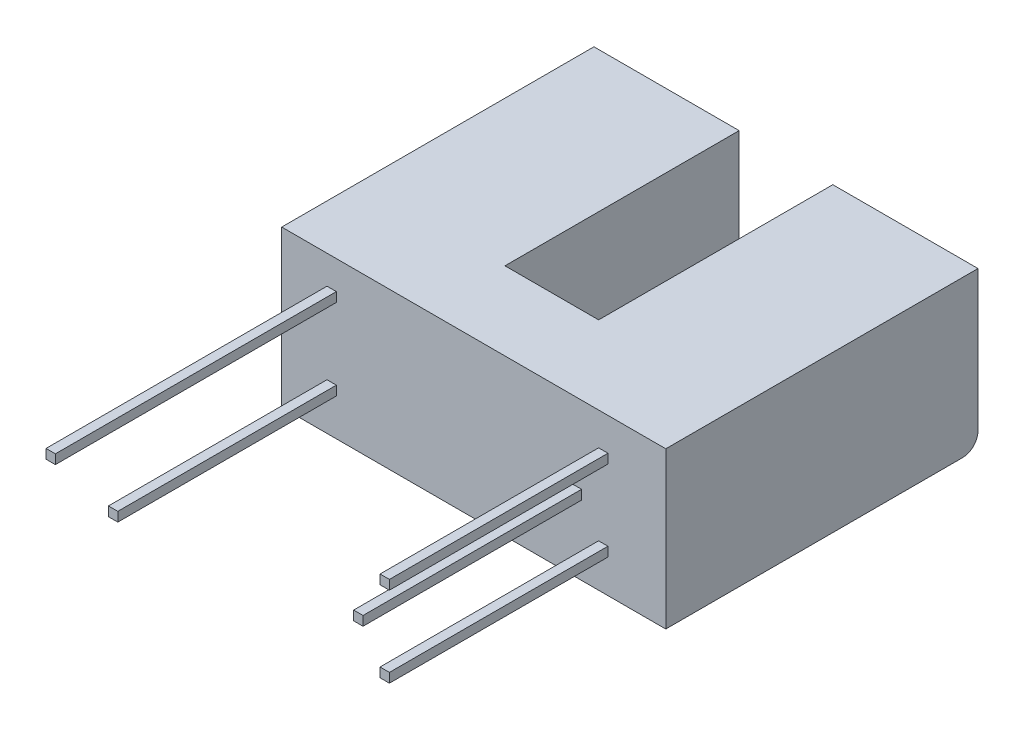
ISO-10303-21;
HEADER;
FILE_DESCRIPTION(('STEP AP214'),'2;1');
FILE_NAME('part.step','',(''),(''),'','','');
FILE_SCHEMA(('AUTOMOTIVE_DESIGN { 1 0 10303 214 1 1 1 1 }'));
ENDSEC;
DATA;
#1=APPLICATION_CONTEXT('core data for automotive mechanical design processes');
#2=APPLICATION_PROTOCOL_DEFINITION('international standard','automotive_design',2000,#1);
#3=PRODUCT_CONTEXT('',#1,'mechanical');
#4=PRODUCT('Part','Part','',(#3));
#5=PRODUCT_RELATED_PRODUCT_CATEGORY('part','',(#4));
#6=PRODUCT_DEFINITION_FORMATION('','',#4);
#7=PRODUCT_DEFINITION_CONTEXT('part definition',#1,'design');
#8=PRODUCT_DEFINITION('design','',#6,#7);
#9=PRODUCT_DEFINITION_SHAPE('','',#8);
#10=(LENGTH_UNIT() NAMED_UNIT(*) SI_UNIT(.MILLI.,.METRE.));
#11=(NAMED_UNIT(*) PLANE_ANGLE_UNIT() SI_UNIT($,.RADIAN.));
#12=(NAMED_UNIT(*) SI_UNIT($,.STERADIAN.) SOLID_ANGLE_UNIT());
#13=UNCERTAINTY_MEASURE_WITH_UNIT(LENGTH_MEASURE(1.E-05),#10,'distance_accuracy_value','');
#14=(GEOMETRIC_REPRESENTATION_CONTEXT(3) GLOBAL_UNCERTAINTY_ASSIGNED_CONTEXT((#13)) GLOBAL_UNIT_ASSIGNED_CONTEXT((#10,
#11,#12)) REPRESENTATION_CONTEXT('',''));
#15=CARTESIAN_POINT('',(0.,0.,0.));
#16=DIRECTION('',(0.,0.,1.));
#17=DIRECTION('',(1.,0.,0.));
#18=AXIS2_PLACEMENT_3D('',#15,#16,#17);
#19=CARTESIAN_POINT('',(-6.15,5.,5.));
#20=DIRECTION('',(0.,0.,-1.));
#21=DIRECTION('',(-1.,0.,0.));
#22=AXIS2_PLACEMENT_3D('',#19,#20,#21);
#23=PLANE('',#22);
#24=DIRECTION('',(0.,-1.,0.));
#25=VECTOR('',#24,1.);
#26=CARTESIAN_POINT('',(3.99904048228154,1.37213930348259,5.));
#27=LINE('',#26,#25);
#28=CARTESIAN_POINT('',(3.99904048228154,1.37213930348259,5.));
#29=VERTEX_POINT('',#28);
#30=CARTESIAN_POINT('',(3.99904048228154,1.07213930348259,5.));
#31=VERTEX_POINT('',#30);
#32=EDGE_CURVE('E250',#29,#31,#27,.T.);
#33=ORIENTED_EDGE('',*,*,#32,.F.);
#34=DIRECTION('',(-1.,0.,0.));
#35=VECTOR('',#34,1.);
#36=CARTESIAN_POINT('',(3.99904048228154,1.37213930348259,5.));
#37=LINE('',#36,#35);
#38=CARTESIAN_POINT('',(4.29904048228154,1.37213930348259,5.));
#39=VERTEX_POINT('',#38);
#40=EDGE_CURVE('E263',#39,#29,#37,.T.);
#41=ORIENTED_EDGE('',*,*,#40,.F.);
#42=DIRECTION('',(0.,1.,0.));
#43=VECTOR('',#42,1.);
#44=CARTESIAN_POINT('',(4.29904048228154,1.37213930348259,5.));
#45=LINE('',#44,#43);
#46=CARTESIAN_POINT('',(4.29904048228154,1.07213930348259,5.));
#47=VERTEX_POINT('',#46);
#48=EDGE_CURVE('E272',#47,#39,#45,.T.);
#49=ORIENTED_EDGE('',*,*,#48,.F.);
#50=DIRECTION('',(1.,0.,0.));
#51=VECTOR('',#50,1.);
#52=CARTESIAN_POINT('',(3.99904048228154,1.07213930348259,5.));
#53=LINE('',#52,#51);
#54=EDGE_CURVE('E253',#31,#47,#53,.T.);
#55=ORIENTED_EDGE('',*,*,#54,.F.);
#56=EDGE_LOOP('',(#33,#41,#49,#55));
#57=FACE_BOUND('',#56,.T.);
#58=DIRECTION('',(0.,-1.,0.));
#59=VECTOR('',#58,1.);
#60=CARTESIAN_POINT('',(-4.69970149253732,1.49029850746269,5.));
#61=LINE('',#60,#59);
#62=CARTESIAN_POINT('',(-4.69970149253732,1.49029850746269,5.));
#63=VERTEX_POINT('',#62);
#64=CARTESIAN_POINT('',(-4.69970149253732,1.19029850746269,5.));
#65=VERTEX_POINT('',#64);
#66=EDGE_CURVE('E320',#63,#65,#61,.T.);
#67=ORIENTED_EDGE('',*,*,#66,.F.);
#68=DIRECTION('',(1.,0.,0.));
#69=VECTOR('',#68,1.);
#70=CARTESIAN_POINT('',(-4.69970149253732,1.49029850746269,5.));
#71=LINE('',#70,#69);
#72=CARTESIAN_POINT('',(-4.39970149253732,1.49029850746269,5.));
#73=VERTEX_POINT('',#72);
#74=EDGE_CURVE('E325',#63,#73,#71,.T.);
#75=ORIENTED_EDGE('',*,*,#74,.T.);
#76=DIRECTION('',(0.,-1.,0.));
#77=VECTOR('',#76,1.);
#78=CARTESIAN_POINT('',(-4.39970149253732,1.49029850746269,5.));
#79=LINE('',#78,#77);
#80=CARTESIAN_POINT('',(-4.39970149253732,1.19029850746269,5.));
#81=VERTEX_POINT('',#80);
#82=EDGE_CURVE('E339',#73,#81,#79,.T.);
#83=ORIENTED_EDGE('',*,*,#82,.T.);
#84=DIRECTION('',(1.,0.,0.));
#85=VECTOR('',#84,1.);
#86=CARTESIAN_POINT('',(-4.69970149253732,1.19029850746269,5.));
#87=LINE('',#86,#85);
#88=EDGE_CURVE('E336',#65,#81,#87,.T.);
#89=ORIENTED_EDGE('',*,*,#88,.F.);
#90=EDGE_LOOP('',(#67,#75,#83,#89));
#91=FACE_BOUND('',#90,.T.);
#92=DIRECTION('',(1.,0.,0.));
#93=VECTOR('',#92,1.);
#94=CARTESIAN_POINT('',(-6.15,0.,5.));
#95=LINE('',#94,#93);
#96=CARTESIAN_POINT('',(-6.15,0.,5.));
#97=VERTEX_POINT('',#96);
#98=CARTESIAN_POINT('',(6.15,0.,5.));
#99=VERTEX_POINT('',#98);
#100=EDGE_CURVE('E414',#97,#99,#95,.T.);
#101=ORIENTED_EDGE('',*,*,#100,.T.);
#102=DIRECTION('',(0.,-1.,0.));
#103=VECTOR('',#102,1.);
#104=CARTESIAN_POINT('',(6.15,5.,5.));
#105=LINE('',#104,#103);
#106=CARTESIAN_POINT('',(6.15,5.,5.));
#107=VERTEX_POINT('',#106);
#108=EDGE_CURVE('E422',#107,#99,#105,.T.);
#109=ORIENTED_EDGE('',*,*,#108,.F.);
#110=DIRECTION('',(1.,0.,0.));
#111=VECTOR('',#110,1.);
#112=CARTESIAN_POINT('',(-6.15,5.,5.));
#113=LINE('',#112,#111);
#114=CARTESIAN_POINT('',(-6.15,5.,5.));
#115=VERTEX_POINT('',#114);
#116=EDGE_CURVE('E420',#115,#107,#113,.T.);
#117=ORIENTED_EDGE('',*,*,#116,.F.);
#118=DIRECTION('',(0.,-1.,0.));
#119=VECTOR('',#118,1.);
#120=CARTESIAN_POINT('',(-6.15,5.,5.));
#121=LINE('',#120,#119);
#122=EDGE_CURVE('E430',#115,#97,#121,.T.);
#123=ORIENTED_EDGE('',*,*,#122,.T.);
#124=EDGE_LOOP('',(#101,#109,#117,#123));
#125=FACE_BOUND('',#124,.T.);
#126=DIRECTION('',(0.,-1.,0.));
#127=VECTOR('',#126,1.);
#128=CARTESIAN_POINT('',(-4.69970149253732,4.08507462686571,5.));
#129=LINE('',#128,#127);
#130=CARTESIAN_POINT('',(-4.69970149253732,4.08507462686571,5.));
#131=VERTEX_POINT('',#130);
#132=CARTESIAN_POINT('',(-4.69970149253732,3.78507462686571,5.));
#133=VERTEX_POINT('',#132);
#134=EDGE_CURVE('E352',#131,#133,#129,.T.);
#135=ORIENTED_EDGE('',*,*,#134,.F.);
#136=DIRECTION('',(-1.,0.,0.));
#137=VECTOR('',#136,1.);
#138=CARTESIAN_POINT('',(-4.69970149253732,4.08507462686571,5.));
#139=LINE('',#138,#137);
#140=CARTESIAN_POINT('',(-4.39970149253732,4.08507462686571,5.));
#141=VERTEX_POINT('',#140);
#142=EDGE_CURVE('E357',#141,#131,#139,.T.);
#143=ORIENTED_EDGE('',*,*,#142,.F.);
#144=DIRECTION('',(0.,1.,0.));
#145=VECTOR('',#144,1.);
#146=CARTESIAN_POINT('',(-4.39970149253732,4.08507462686571,5.));
#147=LINE('',#146,#145);
#148=CARTESIAN_POINT('',(-4.39970149253732,3.78507462686571,5.));
#149=VERTEX_POINT('',#148);
#150=EDGE_CURVE('E369',#149,#141,#147,.T.);
#151=ORIENTED_EDGE('',*,*,#150,.F.);
#152=DIRECTION('',(1.,0.,0.));
#153=VECTOR('',#152,1.);
#154=CARTESIAN_POINT('',(-4.69970149253732,3.78507462686571,5.));
#155=LINE('',#154,#153);
#156=EDGE_CURVE('E366',#133,#149,#155,.T.);
#157=ORIENTED_EDGE('',*,*,#156,.F.);
#158=EDGE_LOOP('',(#135,#143,#151,#157));
#159=FACE_BOUND('',#158,.T.);
#160=DIRECTION('',(0.,-1.,0.));
#161=VECTOR('',#160,1.);
#162=CARTESIAN_POINT('',(3.99904048228154,3.95141001096246,5.));
#163=LINE('',#162,#161);
#164=CARTESIAN_POINT('',(3.99904048228154,3.95141001096246,5.));
#165=VERTEX_POINT('',#164);
#166=CARTESIAN_POINT('',(3.99904048228154,3.65141001096246,5.));
#167=VERTEX_POINT('',#166);
#168=EDGE_CURVE('E288',#165,#167,#163,.T.);
#169=ORIENTED_EDGE('',*,*,#168,.F.);
#170=DIRECTION('',(1.,0.,0.));
#171=VECTOR('',#170,1.);
#172=CARTESIAN_POINT('',(3.99904048228154,3.95141001096246,5.));
#173=LINE('',#172,#171);
#174=CARTESIAN_POINT('',(4.29904048228154,3.95141001096246,5.));
#175=VERTEX_POINT('',#174);
#176=EDGE_CURVE('E293',#165,#175,#173,.T.);
#177=ORIENTED_EDGE('',*,*,#176,.T.);
#178=DIRECTION('',(0.,-1.,0.));
#179=VECTOR('',#178,1.);
#180=CARTESIAN_POINT('',(4.29904048228154,3.95141001096246,5.));
#181=LINE('',#180,#179);
#182=CARTESIAN_POINT('',(4.29904048228154,3.65141001096246,5.));
#183=VERTEX_POINT('',#182);
#184=EDGE_CURVE('E307',#175,#183,#181,.T.);
#185=ORIENTED_EDGE('',*,*,#184,.T.);
#186=DIRECTION('',(1.,0.,0.));
#187=VECTOR('',#186,1.);
#188=CARTESIAN_POINT('',(3.99904048228154,3.65141001096246,5.));
#189=LINE('',#188,#187);
#190=EDGE_CURVE('E304',#167,#183,#189,.T.);
#191=ORIENTED_EDGE('',*,*,#190,.F.);
#192=EDGE_LOOP('',(#169,#177,#185,#191));
#193=FACE_BOUND('',#192,.T.);
#194=DIRECTION('',(0.,-1.,0.));
#195=VECTOR('',#194,1.);
#196=CARTESIAN_POINT('',(3.15364110875112,2.52847839739225,5.));
#197=LINE('',#196,#195);
#198=CARTESIAN_POINT('',(3.15364110875112,2.52847839739225,5.));
#199=VERTEX_POINT('',#198);
#200=CARTESIAN_POINT('',(3.15364110875112,2.22847839739225,5.));
#201=VERTEX_POINT('',#200);
#202=EDGE_CURVE('E249',#199,#201,#197,.T.);
#203=ORIENTED_EDGE('',*,*,#202,.F.);
#204=DIRECTION('',(-1.,0.,0.));
#205=VECTOR('',#204,1.);
#206=CARTESIAN_POINT('',(3.15364110875112,2.52847839739225,5.));
#207=LINE('',#206,#205);
#208=CARTESIAN_POINT('',(3.45364110875112,2.52847839739225,5.));
#209=VERTEX_POINT('',#208);
#210=EDGE_CURVE('E246',#209,#199,#207,.T.);
#211=ORIENTED_EDGE('',*,*,#210,.F.);
#212=DIRECTION('',(0.,1.,0.));
#213=VECTOR('',#212,1.);
#214=CARTESIAN_POINT('',(3.45364110875112,2.52847839739225,5.));
#215=LINE('',#214,#213);
#216=CARTESIAN_POINT('',(3.45364110875112,2.22847839739225,5.));
#217=VERTEX_POINT('',#216);
#218=EDGE_CURVE('E53',#217,#209,#215,.T.);
#219=ORIENTED_EDGE('',*,*,#218,.F.);
#220=DIRECTION('',(1.,0.,0.));
#221=VECTOR('',#220,1.);
#222=CARTESIAN_POINT('',(3.15364110875112,2.22847839739225,5.));
#223=LINE('',#222,#221);
#224=EDGE_CURVE('E48',#201,#217,#223,.T.);
#225=ORIENTED_EDGE('',*,*,#224,.F.);
#226=EDGE_LOOP('',(#203,#211,#219,#225));
#227=FACE_BOUND('',#226,.T.);
#228=ADVANCED_FACE('F33',(#57,#91,#125,#159,#193,#227),#23,.F.);
#229=CARTESIAN_POINT('',(-6.15,5.,-5.));
#230=DIRECTION('',(0.,0.,1.));
#231=DIRECTION('',(1.,0.,0.));
#232=AXIS2_PLACEMENT_3D('',#229,#230,#231);
#233=PLANE('',#232);
#234=DIRECTION('',(0.,-1.,0.));
#235=VECTOR('',#234,1.);
#236=CARTESIAN_POINT('',(6.15,5.,-5.));
#237=LINE('',#236,#235);
#238=CARTESIAN_POINT('',(6.15,5.,-5.));
#239=VERTEX_POINT('',#238);
#240=CARTESIAN_POINT('',(6.15,0.5,-5.));
#241=VERTEX_POINT('',#240);
#242=EDGE_CURVE('E436',#239,#241,#237,.T.);
#243=ORIENTED_EDGE('',*,*,#242,.T.);
#244=DIRECTION('',(-1.,0.,0.));
#245=VECTOR('',#244,1.);
#246=CARTESIAN_POINT('',(-6.15,0.5,-5.));
#247=LINE('',#246,#245);
#248=CARTESIAN_POINT('',(1.5,0.5,-5.));
#249=VERTEX_POINT('',#248);
#250=EDGE_CURVE('E450',#241,#249,#247,.T.);
#251=ORIENTED_EDGE('',*,*,#250,.T.);
#252=DIRECTION('',(0.,1.,0.));
#253=VECTOR('',#252,1.);
#254=CARTESIAN_POINT('',(1.5,0.,-5.));
#255=LINE('',#254,#253);
#256=CARTESIAN_POINT('',(1.5,5.,-5.));
#257=VERTEX_POINT('',#256);
#258=EDGE_CURVE('E393',#249,#257,#255,.T.);
#259=ORIENTED_EDGE('',*,*,#258,.T.);
#260=DIRECTION('',(-1.,0.,0.));
#261=VECTOR('',#260,1.);
#262=CARTESIAN_POINT('',(-6.15,5.,-5.));
#263=LINE('',#262,#261);
#264=EDGE_CURVE('E415',#239,#257,#263,.T.);
#265=ORIENTED_EDGE('',*,*,#264,.F.);
#266=EDGE_LOOP('',(#243,#251,#259,#265));
#267=FACE_BOUND('',#266,.T.);
#268=ADVANCED_FACE('F472',(#267),#233,.F.);
#269=CARTESIAN_POINT('',(0.,5.,0.));
#270=DIRECTION('',(0.,1.,0.));
#271=DIRECTION('',(0.,0.,1.));
#272=AXIS2_PLACEMENT_3D('',#269,#270,#271);
#273=PLANE('',#272);
#274=ORIENTED_EDGE('',*,*,#264,.T.);
#275=DIRECTION('',(0.,0.,1.));
#276=VECTOR('',#275,1.);
#277=CARTESIAN_POINT('',(1.5,5.,-5.));
#278=LINE('',#277,#276);
#279=CARTESIAN_POINT('',(1.5,5.,2.5));
#280=VERTEX_POINT('',#279);
#281=EDGE_CURVE('E385',#257,#280,#278,.T.);
#282=ORIENTED_EDGE('',*,*,#281,.T.);
#283=DIRECTION('',(1.,0.,0.));
#284=VECTOR('',#283,1.);
#285=CARTESIAN_POINT('',(-1.5,5.,2.5));
#286=LINE('',#285,#284);
#287=CARTESIAN_POINT('',(-1.5,5.,2.5));
#288=VERTEX_POINT('',#287);
#289=EDGE_CURVE('E395',#288,#280,#286,.T.);
#290=ORIENTED_EDGE('',*,*,#289,.F.);
#291=DIRECTION('',(0.,0.,1.));
#292=VECTOR('',#291,1.);
#293=CARTESIAN_POINT('',(-1.5,5.,-5.));
#294=LINE('',#293,#292);
#295=CARTESIAN_POINT('',(-1.5,5.,-5.));
#296=VERTEX_POINT('',#295);
#297=EDGE_CURVE('E400',#296,#288,#294,.T.);
#298=ORIENTED_EDGE('',*,*,#297,.F.);
#299=CARTESIAN_POINT('',(-6.15,5.,-5.));
#300=VERTEX_POINT('',#299);
#301=EDGE_CURVE('E413',#296,#300,#263,.T.);
#302=ORIENTED_EDGE('',*,*,#301,.T.);
#303=DIRECTION('',(0.,0.,1.));
#304=VECTOR('',#303,1.);
#305=CARTESIAN_POINT('',(-6.15,5.,-5.));
#306=LINE('',#305,#304);
#307=EDGE_CURVE('E418',#300,#115,#306,.T.);
#308=ORIENTED_EDGE('',*,*,#307,.T.);
#309=ORIENTED_EDGE('',*,*,#116,.T.);
#310=DIRECTION('',(0.,0.,-1.));
#311=VECTOR('',#310,1.);
#312=CARTESIAN_POINT('',(6.15,5.,-5.));
#313=LINE('',#312,#311);
#314=EDGE_CURVE('E410',#107,#239,#313,.T.);
#315=ORIENTED_EDGE('',*,*,#314,.T.);
#316=EDGE_LOOP('',(#274,#282,#290,#298,#302,#308,#309,#315));
#317=FACE_BOUND('',#316,.T.);
#318=ADVANCED_FACE('F474',(#317),#273,.T.);
#319=CARTESIAN_POINT('',(0.,0.,0.));
#320=DIRECTION('',(0.,1.,0.));
#321=DIRECTION('',(0.,0.,1.));
#322=AXIS2_PLACEMENT_3D('',#319,#320,#321);
#323=PLANE('',#322);
#324=DIRECTION('',(0.,0.,1.));
#325=VECTOR('',#324,1.);
#326=CARTESIAN_POINT('',(-6.15,0.,-5.));
#327=LINE('',#326,#325);
#328=CARTESIAN_POINT('',(-6.15,0.,-4.5));
#329=VERTEX_POINT('',#328);
#330=EDGE_CURVE('E425',#329,#97,#327,.T.);
#331=ORIENTED_EDGE('',*,*,#330,.F.);
#332=DIRECTION('',(-1.,0.,0.));
#333=VECTOR('',#332,1.);
#334=CARTESIAN_POINT('',(0.,0.,-4.5));
#335=LINE('',#334,#333);
#336=CARTESIAN_POINT('',(-1.5,0.,-4.5));
#337=VERTEX_POINT('',#336);
#338=EDGE_CURVE('E446',#329,#337,#335,.F.);
#339=ORIENTED_EDGE('',*,*,#338,.T.);
#340=DIRECTION('',(0.,0.,1.));
#341=VECTOR('',#340,1.);
#342=CARTESIAN_POINT('',(-1.5,0.,-5.));
#343=LINE('',#342,#341);
#344=CARTESIAN_POINT('',(-1.5,0.,2.5));
#345=VERTEX_POINT('',#344);
#346=EDGE_CURVE('E399',#337,#345,#343,.T.);
#347=ORIENTED_EDGE('',*,*,#346,.T.);
#348=DIRECTION('',(1.,0.,0.));
#349=VECTOR('',#348,1.);
#350=CARTESIAN_POINT('',(-1.5,0.,2.5));
#351=LINE('',#350,#349);
#352=CARTESIAN_POINT('',(1.5,0.,2.5));
#353=VERTEX_POINT('',#352);
#354=EDGE_CURVE('E396',#345,#353,#351,.T.);
#355=ORIENTED_EDGE('',*,*,#354,.T.);
#356=DIRECTION('',(0.,0.,1.));
#357=VECTOR('',#356,1.);
#358=CARTESIAN_POINT('',(1.5,0.,-5.));
#359=LINE('',#358,#357);
#360=CARTESIAN_POINT('',(1.5,0.,-4.5));
#361=VERTEX_POINT('',#360);
#362=EDGE_CURVE('E386',#361,#353,#359,.T.);
#363=ORIENTED_EDGE('',*,*,#362,.F.);
#364=DIRECTION('',(-1.,0.,0.));
#365=VECTOR('',#364,1.);
#366=CARTESIAN_POINT('',(0.,0.,-4.5));
#367=LINE('',#366,#365);
#368=CARTESIAN_POINT('',(6.15,0.,-4.5));
#369=VERTEX_POINT('',#368);
#370=EDGE_CURVE('E444',#361,#369,#367,.F.);
#371=ORIENTED_EDGE('',*,*,#370,.T.);
#372=DIRECTION('',(0.,0.,-1.));
#373=VECTOR('',#372,1.);
#374=CARTESIAN_POINT('',(6.15,0.,-5.));
#375=LINE('',#374,#373);
#376=EDGE_CURVE('E409',#99,#369,#375,.T.);
#377=ORIENTED_EDGE('',*,*,#376,.F.);
#378=ORIENTED_EDGE('',*,*,#100,.F.);
#379=EDGE_LOOP('',(#331,#339,#347,#355,#363,#371,#377,#378));
#380=FACE_BOUND('',#379,.T.);
#381=ADVANCED_FACE('F462',(#380),#323,.F.);
#382=CARTESIAN_POINT('',(6.15,5.,-5.));
#383=DIRECTION('',(-1.,0.,0.));
#384=DIRECTION('',(0.,0.,1.));
#385=AXIS2_PLACEMENT_3D('',#382,#383,#384);
#386=PLANE('',#385);
#387=ORIENTED_EDGE('',*,*,#376,.T.);
#388=CARTESIAN_POINT('',(6.15,0.5,-4.5));
#389=DIRECTION('',(-1.,0.,0.));
#390=DIRECTION('',(0.,0.,1.));
#391=AXIS2_PLACEMENT_3D('',#388,#389,#390);
#392=CIRCLE('',#391,0.5);
#393=EDGE_CURVE('E11',#369,#241,#392,.F.);
#394=ORIENTED_EDGE('',*,*,#393,.T.);
#395=ORIENTED_EDGE('',*,*,#242,.F.);
#396=ORIENTED_EDGE('',*,*,#314,.F.);
#397=ORIENTED_EDGE('',*,*,#108,.T.);
#398=EDGE_LOOP('',(#387,#394,#395,#396,#397));
#399=FACE_BOUND('',#398,.T.);
#400=ADVANCED_FACE('F469',(#399),#386,.F.);
#401=DIRECTION('',(0.,1.,0.));
#402=VECTOR('',#401,1.);
#403=CARTESIAN_POINT('',(-1.5,0.,-5.));
#404=LINE('',#403,#402);
#405=CARTESIAN_POINT('',(-1.5,0.5,-5.));
#406=VERTEX_POINT('',#405);
#407=EDGE_CURVE('E402',#406,#296,#404,.T.);
#408=ORIENTED_EDGE('',*,*,#407,.F.);
#409=DIRECTION('',(-1.,0.,0.));
#410=VECTOR('',#409,1.);
#411=CARTESIAN_POINT('',(-6.15,0.5,-5.));
#412=LINE('',#411,#410);
#413=CARTESIAN_POINT('',(-6.15,0.5,-5.));
#414=VERTEX_POINT('',#413);
#415=EDGE_CURVE('E439',#406,#414,#412,.T.);
#416=ORIENTED_EDGE('',*,*,#415,.T.);
#417=DIRECTION('',(0.,-1.,0.));
#418=VECTOR('',#417,1.);
#419=CARTESIAN_POINT('',(-6.15,5.,-5.));
#420=LINE('',#419,#418);
#421=EDGE_CURVE('E433',#300,#414,#420,.T.);
#422=ORIENTED_EDGE('',*,*,#421,.F.);
#423=ORIENTED_EDGE('',*,*,#301,.F.);
#424=EDGE_LOOP('',(#408,#416,#422,#423));
#425=FACE_BOUND('',#424,.T.);
#426=ADVANCED_FACE('F492',(#425),#233,.F.);
#427=CARTESIAN_POINT('',(-6.15,5.,-5.));
#428=DIRECTION('',(1.,0.,0.));
#429=DIRECTION('',(0.,0.,-1.));
#430=AXIS2_PLACEMENT_3D('',#427,#428,#429);
#431=PLANE('',#430);
#432=ORIENTED_EDGE('',*,*,#421,.T.);
#433=CARTESIAN_POINT('',(-6.15,0.5,-4.5));
#434=DIRECTION('',(1.,0.,0.));
#435=DIRECTION('',(0.,0.,-1.));
#436=AXIS2_PLACEMENT_3D('',#433,#434,#435);
#437=CIRCLE('',#436,0.5);
#438=EDGE_CURVE('E442',#414,#329,#437,.F.);
#439=ORIENTED_EDGE('',*,*,#438,.T.);
#440=ORIENTED_EDGE('',*,*,#330,.T.);
#441=ORIENTED_EDGE('',*,*,#122,.F.);
#442=ORIENTED_EDGE('',*,*,#307,.F.);
#443=EDGE_LOOP('',(#432,#439,#440,#441,#442));
#444=FACE_BOUND('',#443,.T.);
#445=ADVANCED_FACE('F484',(#444),#431,.F.);
#446=CARTESIAN_POINT('',(-1.5,0.,2.5));
#447=DIRECTION('',(0.,0.,1.));
#448=DIRECTION('',(1.,0.,0.));
#449=AXIS2_PLACEMENT_3D('',#446,#447,#448);
#450=PLANE('',#449);
#451=ORIENTED_EDGE('',*,*,#289,.T.);
#452=DIRECTION('',(0.,1.,0.));
#453=VECTOR('',#452,1.);
#454=CARTESIAN_POINT('',(1.5,0.,2.5));
#455=LINE('',#454,#453);
#456=EDGE_CURVE('E388',#353,#280,#455,.T.);
#457=ORIENTED_EDGE('',*,*,#456,.F.);
#458=ORIENTED_EDGE('',*,*,#354,.F.);
#459=DIRECTION('',(0.,1.,0.));
#460=VECTOR('',#459,1.);
#461=CARTESIAN_POINT('',(-1.5,0.,2.5));
#462=LINE('',#461,#460);
#463=EDGE_CURVE('E407',#345,#288,#462,.T.);
#464=ORIENTED_EDGE('',*,*,#463,.T.);
#465=EDGE_LOOP('',(#451,#457,#458,#464));
#466=FACE_BOUND('',#465,.T.);
#467=ADVANCED_FACE('F501',(#466),#450,.F.);
#468=CARTESIAN_POINT('',(-1.5,0.,-5.));
#469=DIRECTION('',(-1.,0.,0.));
#470=DIRECTION('',(0.,0.,1.));
#471=AXIS2_PLACEMENT_3D('',#468,#469,#470);
#472=PLANE('',#471);
#473=ORIENTED_EDGE('',*,*,#346,.F.);
#474=CARTESIAN_POINT('',(-1.5,0.5,-4.5));
#475=DIRECTION('',(-1.,0.,0.));
#476=DIRECTION('',(0.,0.,1.));
#477=AXIS2_PLACEMENT_3D('',#474,#475,#476);
#478=CIRCLE('',#477,0.5);
#479=EDGE_CURVE('E448',#337,#406,#478,.F.);
#480=ORIENTED_EDGE('',*,*,#479,.T.);
#481=ORIENTED_EDGE('',*,*,#407,.T.);
#482=ORIENTED_EDGE('',*,*,#297,.T.);
#483=ORIENTED_EDGE('',*,*,#463,.F.);
#484=EDGE_LOOP('',(#473,#480,#481,#482,#483));
#485=FACE_BOUND('',#484,.T.);
#486=ADVANCED_FACE('F497',(#485),#472,.F.);
#487=CARTESIAN_POINT('',(1.5,0.,-5.));
#488=DIRECTION('',(-1.,0.,0.));
#489=DIRECTION('',(0.,0.,1.));
#490=AXIS2_PLACEMENT_3D('',#487,#488,#489);
#491=PLANE('',#490);
#492=ORIENTED_EDGE('',*,*,#258,.F.);
#493=CARTESIAN_POINT('',(1.5,0.5,-4.5));
#494=DIRECTION('',(-1.,0.,0.));
#495=DIRECTION('',(0.,0.,1.));
#496=AXIS2_PLACEMENT_3D('',#493,#494,#495);
#497=CIRCLE('',#496,0.5);
#498=EDGE_CURVE('E41',#249,#361,#497,.T.);
#499=ORIENTED_EDGE('',*,*,#498,.T.);
#500=ORIENTED_EDGE('',*,*,#362,.T.);
#501=ORIENTED_EDGE('',*,*,#456,.T.);
#502=ORIENTED_EDGE('',*,*,#281,.F.);
#503=EDGE_LOOP('',(#492,#499,#500,#501,#502));
#504=FACE_BOUND('',#503,.T.);
#505=ADVANCED_FACE('F455',(#504),#491,.T.);
#506=CARTESIAN_POINT('',(-6.15,0.5,-4.5));
#507=DIRECTION('',(-1.,0.,0.));
#508=DIRECTION('',(0.,0.,1.));
#509=AXIS2_PLACEMENT_3D('',#506,#507,#508);
#510=CYLINDRICAL_SURFACE('',#509,0.5);
#511=ORIENTED_EDGE('',*,*,#479,.F.);
#512=ORIENTED_EDGE('',*,*,#338,.F.);
#513=ORIENTED_EDGE('',*,*,#438,.F.);
#514=ORIENTED_EDGE('',*,*,#415,.F.);
#515=EDGE_LOOP('',(#511,#512,#513,#514));
#516=FACE_BOUND('',#515,.T.);
#517=ADVANCED_FACE('F489',(#516),#510,.T.);
#518=CARTESIAN_POINT('',(-6.15,0.5,-4.5));
#519=DIRECTION('',(-1.,0.,0.));
#520=DIRECTION('',(0.,0.,1.));
#521=AXIS2_PLACEMENT_3D('',#518,#519,#520);
#522=CYLINDRICAL_SURFACE('',#521,0.5);
#523=ORIENTED_EDGE('',*,*,#393,.F.);
#524=ORIENTED_EDGE('',*,*,#370,.F.);
#525=ORIENTED_EDGE('',*,*,#498,.F.);
#526=ORIENTED_EDGE('',*,*,#250,.F.);
#527=EDGE_LOOP('',(#523,#524,#525,#526));
#528=FACE_BOUND('',#527,.T.);
#529=ADVANCED_FACE('F35',(#528),#522,.T.);
#530=CARTESIAN_POINT('',(-4.69970149253732,4.08507462686571,14.));
#531=DIRECTION('',(1.,0.,0.));
#532=DIRECTION('',(0.,0.,-1.));
#533=AXIS2_PLACEMENT_3D('',#530,#531,#532);
#534=PLANE('',#533);
#535=ORIENTED_EDGE('',*,*,#134,.T.);
#536=DIRECTION('',(0.,0.,-1.));
#537=VECTOR('',#536,1.);
#538=CARTESIAN_POINT('',(-4.69970149253732,3.78507462686571,14.));
#539=LINE('',#538,#537);
#540=CARTESIAN_POINT('',(-4.69970149253732,3.78507462686571,14.));
#541=VERTEX_POINT('',#540);
#542=EDGE_CURVE('E382',#541,#133,#539,.T.);
#543=ORIENTED_EDGE('',*,*,#542,.F.);
#544=DIRECTION('',(0.,-1.,0.));
#545=VECTOR('',#544,1.);
#546=CARTESIAN_POINT('',(-4.69970149253732,4.08507462686571,14.));
#547=LINE('',#546,#545);
#548=CARTESIAN_POINT('',(-4.69970149253732,4.08507462686571,14.));
#549=VERTEX_POINT('',#548);
#550=EDGE_CURVE('E353',#549,#541,#547,.T.);
#551=ORIENTED_EDGE('',*,*,#550,.F.);
#552=DIRECTION('',(0.,0.,-1.));
#553=VECTOR('',#552,1.);
#554=CARTESIAN_POINT('',(-4.69970149253732,4.08507462686571,14.));
#555=LINE('',#554,#553);
#556=EDGE_CURVE('E363',#549,#131,#555,.T.);
#557=ORIENTED_EDGE('',*,*,#556,.T.);
#558=EDGE_LOOP('',(#535,#543,#551,#557));
#559=FACE_BOUND('',#558,.T.);
#560=ADVANCED_FACE('F528',(#559),#534,.F.);
#561=CARTESIAN_POINT('',(-4.69970149253732,3.78507462686571,14.));
#562=DIRECTION('',(0.,1.,0.));
#563=DIRECTION('',(0.,0.,1.));
#564=AXIS2_PLACEMENT_3D('',#561,#562,#563);
#565=PLANE('',#564);
#566=ORIENTED_EDGE('',*,*,#156,.T.);
#567=DIRECTION('',(0.,0.,-1.));
#568=VECTOR('',#567,1.);
#569=CARTESIAN_POINT('',(-4.39970149253732,3.78507462686571,14.));
#570=LINE('',#569,#568);
#571=CARTESIAN_POINT('',(-4.39970149253732,3.78507462686571,14.));
#572=VERTEX_POINT('',#571);
#573=EDGE_CURVE('E379',#572,#149,#570,.T.);
#574=ORIENTED_EDGE('',*,*,#573,.F.);
#575=DIRECTION('',(1.,0.,0.));
#576=VECTOR('',#575,1.);
#577=CARTESIAN_POINT('',(-4.69970149253732,3.78507462686571,14.));
#578=LINE('',#577,#576);
#579=EDGE_CURVE('E356',#541,#572,#578,.T.);
#580=ORIENTED_EDGE('',*,*,#579,.F.);
#581=ORIENTED_EDGE('',*,*,#542,.T.);
#582=EDGE_LOOP('',(#566,#574,#580,#581));
#583=FACE_BOUND('',#582,.T.);
#584=ADVANCED_FACE('F535',(#583),#565,.F.);
#585=CARTESIAN_POINT('',(-4.39970149253732,4.08507462686571,14.));
#586=DIRECTION('',(-1.,0.,0.));
#587=DIRECTION('',(0.,0.,1.));
#588=AXIS2_PLACEMENT_3D('',#585,#586,#587);
#589=PLANE('',#588);
#590=ORIENTED_EDGE('',*,*,#150,.T.);
#591=DIRECTION('',(0.,0.,-1.));
#592=VECTOR('',#591,1.);
#593=CARTESIAN_POINT('',(-4.39970149253732,4.08507462686571,14.));
#594=LINE('',#593,#592);
#595=CARTESIAN_POINT('',(-4.39970149253732,4.08507462686571,14.));
#596=VERTEX_POINT('',#595);
#597=EDGE_CURVE('E376',#596,#141,#594,.T.);
#598=ORIENTED_EDGE('',*,*,#597,.F.);
#599=DIRECTION('',(0.,1.,0.));
#600=VECTOR('',#599,1.);
#601=CARTESIAN_POINT('',(-4.39970149253732,4.08507462686571,14.));
#602=LINE('',#601,#600);
#603=EDGE_CURVE('E359',#572,#596,#602,.T.);
#604=ORIENTED_EDGE('',*,*,#603,.F.);
#605=ORIENTED_EDGE('',*,*,#573,.T.);
#606=EDGE_LOOP('',(#590,#598,#604,#605));
#607=FACE_BOUND('',#606,.T.);
#608=ADVANCED_FACE('F539',(#607),#589,.F.);
#609=CARTESIAN_POINT('',(-4.69970149253732,4.08507462686571,14.));
#610=DIRECTION('',(0.,-1.,0.));
#611=DIRECTION('',(0.,0.,-1.));
#612=AXIS2_PLACEMENT_3D('',#609,#610,#611);
#613=PLANE('',#612);
#614=ORIENTED_EDGE('',*,*,#142,.T.);
#615=ORIENTED_EDGE('',*,*,#556,.F.);
#616=DIRECTION('',(-1.,0.,0.));
#617=VECTOR('',#616,1.);
#618=CARTESIAN_POINT('',(-4.69970149253732,4.08507462686571,14.));
#619=LINE('',#618,#617);
#620=EDGE_CURVE('E361',#596,#549,#619,.T.);
#621=ORIENTED_EDGE('',*,*,#620,.F.);
#622=ORIENTED_EDGE('',*,*,#597,.T.);
#623=EDGE_LOOP('',(#614,#615,#621,#622));
#624=FACE_BOUND('',#623,.T.);
#625=ADVANCED_FACE('F543',(#624),#613,.F.);
#626=CARTESIAN_POINT('',(0.,0.,14.));
#627=DIRECTION('',(0.,0.,1.));
#628=DIRECTION('',(1.,0.,0.));
#629=AXIS2_PLACEMENT_3D('',#626,#627,#628);
#630=PLANE('',#629);
#631=ORIENTED_EDGE('',*,*,#550,.T.);
#632=ORIENTED_EDGE('',*,*,#579,.T.);
#633=ORIENTED_EDGE('',*,*,#603,.T.);
#634=ORIENTED_EDGE('',*,*,#620,.T.);
#635=EDGE_LOOP('',(#631,#632,#633,#634));
#636=FACE_BOUND('',#635,.T.);
#637=ADVANCED_FACE('F547',(#636),#630,.T.);
#638=CARTESIAN_POINT('',(-4.69970149253732,1.49029850746269,12.));
#639=DIRECTION('',(1.,0.,0.));
#640=DIRECTION('',(0.,0.,-1.));
#641=AXIS2_PLACEMENT_3D('',#638,#639,#640);
#642=PLANE('',#641);
#643=ORIENTED_EDGE('',*,*,#66,.T.);
#644=DIRECTION('',(0.,0.,-1.));
#645=VECTOR('',#644,1.);
#646=CARTESIAN_POINT('',(-4.69970149253732,1.19029850746269,12.));
#647=LINE('',#646,#645);
#648=CARTESIAN_POINT('',(-4.69970149253732,1.19029850746269,12.));
#649=VERTEX_POINT('',#648);
#650=EDGE_CURVE('E350',#649,#65,#647,.T.);
#651=ORIENTED_EDGE('',*,*,#650,.F.);
#652=DIRECTION('',(0.,-1.,0.));
#653=VECTOR('',#652,1.);
#654=CARTESIAN_POINT('',(-4.69970149253732,1.49029850746269,12.));
#655=LINE('',#654,#653);
#656=CARTESIAN_POINT('',(-4.69970149253732,1.49029850746269,12.));
#657=VERTEX_POINT('',#656);
#658=EDGE_CURVE('E321',#657,#649,#655,.T.);
#659=ORIENTED_EDGE('',*,*,#658,.F.);
#660=DIRECTION('',(0.,0.,-1.));
#661=VECTOR('',#660,1.);
#662=CARTESIAN_POINT('',(-4.69970149253732,1.49029850746269,12.));
#663=LINE('',#662,#661);
#664=EDGE_CURVE('E333',#657,#63,#663,.T.);
#665=ORIENTED_EDGE('',*,*,#664,.T.);
#666=EDGE_LOOP('',(#643,#651,#659,#665));
#667=FACE_BOUND('',#666,.T.);
#668=ADVANCED_FACE('F551',(#667),#642,.F.);
#669=CARTESIAN_POINT('',(-4.69970149253732,1.19029850746269,12.));
#670=DIRECTION('',(0.,1.,0.));
#671=DIRECTION('',(0.,0.,1.));
#672=AXIS2_PLACEMENT_3D('',#669,#670,#671);
#673=PLANE('',#672);
#674=ORIENTED_EDGE('',*,*,#88,.T.);
#675=DIRECTION('',(0.,0.,-1.));
#676=VECTOR('',#675,1.);
#677=CARTESIAN_POINT('',(-4.39970149253732,1.19029850746269,12.));
#678=LINE('',#677,#676);
#679=CARTESIAN_POINT('',(-4.39970149253732,1.19029850746269,12.));
#680=VERTEX_POINT('',#679);
#681=EDGE_CURVE('E348',#680,#81,#678,.T.);
#682=ORIENTED_EDGE('',*,*,#681,.F.);
#683=DIRECTION('',(1.,0.,0.));
#684=VECTOR('',#683,1.);
#685=CARTESIAN_POINT('',(-4.69970149253732,1.19029850746269,12.));
#686=LINE('',#685,#684);
#687=EDGE_CURVE('E324',#649,#680,#686,.T.);
#688=ORIENTED_EDGE('',*,*,#687,.F.);
#689=ORIENTED_EDGE('',*,*,#650,.T.);
#690=EDGE_LOOP('',(#674,#682,#688,#689));
#691=FACE_BOUND('',#690,.T.);
#692=ADVANCED_FACE('F555',(#691),#673,.F.);
#693=CARTESIAN_POINT('',(-4.39970149253732,1.49029850746269,12.));
#694=DIRECTION('',(1.,0.,0.));
#695=DIRECTION('',(0.,0.,-1.));
#696=AXIS2_PLACEMENT_3D('',#693,#694,#695);
#697=PLANE('',#696);
#698=ORIENTED_EDGE('',*,*,#82,.F.);
#699=DIRECTION('',(0.,0.,-1.));
#700=VECTOR('',#699,1.);
#701=CARTESIAN_POINT('',(-4.39970149253732,1.49029850746269,12.));
#702=LINE('',#701,#700);
#703=CARTESIAN_POINT('',(-4.39970149253732,1.49029850746269,12.));
#704=VERTEX_POINT('',#703);
#705=EDGE_CURVE('E345',#704,#73,#702,.T.);
#706=ORIENTED_EDGE('',*,*,#705,.F.);
#707=DIRECTION('',(0.,-1.,0.));
#708=VECTOR('',#707,1.);
#709=CARTESIAN_POINT('',(-4.39970149253732,1.49029850746269,12.));
#710=LINE('',#709,#708);
#711=EDGE_CURVE('E327',#704,#680,#710,.T.);
#712=ORIENTED_EDGE('',*,*,#711,.T.);
#713=ORIENTED_EDGE('',*,*,#681,.T.);
#714=EDGE_LOOP('',(#698,#706,#712,#713));
#715=FACE_BOUND('',#714,.T.);
#716=ADVANCED_FACE('F559',(#715),#697,.T.);
#717=CARTESIAN_POINT('',(-4.69970149253732,1.49029850746269,12.));
#718=DIRECTION('',(0.,1.,0.));
#719=DIRECTION('',(0.,0.,1.));
#720=AXIS2_PLACEMENT_3D('',#717,#718,#719);
#721=PLANE('',#720);
#722=ORIENTED_EDGE('',*,*,#74,.F.);
#723=ORIENTED_EDGE('',*,*,#664,.F.);
#724=DIRECTION('',(1.,0.,0.));
#725=VECTOR('',#724,1.);
#726=CARTESIAN_POINT('',(-4.69970149253732,1.49029850746269,12.));
#727=LINE('',#726,#725);
#728=EDGE_CURVE('E330',#657,#704,#727,.T.);
#729=ORIENTED_EDGE('',*,*,#728,.T.);
#730=ORIENTED_EDGE('',*,*,#705,.T.);
#731=EDGE_LOOP('',(#722,#723,#729,#730));
#732=FACE_BOUND('',#731,.T.);
#733=ADVANCED_FACE('F563',(#732),#721,.T.);
#734=CARTESIAN_POINT('',(0.,0.,12.));
#735=DIRECTION('',(0.,0.,1.));
#736=DIRECTION('',(1.,0.,0.));
#737=AXIS2_PLACEMENT_3D('',#734,#735,#736);
#738=PLANE('',#737);
#739=ORIENTED_EDGE('',*,*,#658,.T.);
#740=ORIENTED_EDGE('',*,*,#687,.T.);
#741=ORIENTED_EDGE('',*,*,#711,.F.);
#742=ORIENTED_EDGE('',*,*,#728,.F.);
#743=EDGE_LOOP('',(#739,#740,#741,#742));
#744=FACE_BOUND('',#743,.T.);
#745=ADVANCED_FACE('F567',(#744),#738,.T.);
#746=CARTESIAN_POINT('',(3.99904048228154,3.95141001096246,12.));
#747=DIRECTION('',(1.,0.,0.));
#748=DIRECTION('',(0.,0.,-1.));
#749=AXIS2_PLACEMENT_3D('',#746,#747,#748);
#750=PLANE('',#749);
#751=ORIENTED_EDGE('',*,*,#168,.T.);
#752=DIRECTION('',(0.,0.,-1.));
#753=VECTOR('',#752,1.);
#754=CARTESIAN_POINT('',(3.99904048228154,3.65141001096246,12.));
#755=LINE('',#754,#753);
#756=CARTESIAN_POINT('',(3.99904048228154,3.65141001096246,12.));
#757=VERTEX_POINT('',#756);
#758=EDGE_CURVE('E318',#757,#167,#755,.T.);
#759=ORIENTED_EDGE('',*,*,#758,.F.);
#760=DIRECTION('',(0.,-1.,0.));
#761=VECTOR('',#760,1.);
#762=CARTESIAN_POINT('',(3.99904048228154,3.95141001096246,12.));
#763=LINE('',#762,#761);
#764=CARTESIAN_POINT('',(3.99904048228154,3.95141001096246,12.));
#765=VERTEX_POINT('',#764);
#766=EDGE_CURVE('E289',#765,#757,#763,.T.);
#767=ORIENTED_EDGE('',*,*,#766,.F.);
#768=DIRECTION('',(0.,0.,-1.));
#769=VECTOR('',#768,1.);
#770=CARTESIAN_POINT('',(3.99904048228154,3.95141001096246,12.));
#771=LINE('',#770,#769);
#772=EDGE_CURVE('E301',#765,#165,#771,.T.);
#773=ORIENTED_EDGE('',*,*,#772,.T.);
#774=EDGE_LOOP('',(#751,#759,#767,#773));
#775=FACE_BOUND('',#774,.T.);
#776=ADVANCED_FACE('F571',(#775),#750,.F.);
#777=CARTESIAN_POINT('',(3.99904048228154,3.65141001096246,12.));
#778=DIRECTION('',(0.,1.,0.));
#779=DIRECTION('',(0.,0.,1.));
#780=AXIS2_PLACEMENT_3D('',#777,#778,#779);
#781=PLANE('',#780);
#782=ORIENTED_EDGE('',*,*,#190,.T.);
#783=DIRECTION('',(0.,0.,-1.));
#784=VECTOR('',#783,1.);
#785=CARTESIAN_POINT('',(4.29904048228154,3.65141001096246,12.));
#786=LINE('',#785,#784);
#787=CARTESIAN_POINT('',(4.29904048228154,3.65141001096246,12.));
#788=VERTEX_POINT('',#787);
#789=EDGE_CURVE('E316',#788,#183,#786,.T.);
#790=ORIENTED_EDGE('',*,*,#789,.F.);
#791=DIRECTION('',(1.,0.,0.));
#792=VECTOR('',#791,1.);
#793=CARTESIAN_POINT('',(3.99904048228154,3.65141001096246,12.));
#794=LINE('',#793,#792);
#795=EDGE_CURVE('E292',#757,#788,#794,.T.);
#796=ORIENTED_EDGE('',*,*,#795,.F.);
#797=ORIENTED_EDGE('',*,*,#758,.T.);
#798=EDGE_LOOP('',(#782,#790,#796,#797));
#799=FACE_BOUND('',#798,.T.);
#800=ADVANCED_FACE('F575',(#799),#781,.F.);
#801=CARTESIAN_POINT('',(4.29904048228154,3.95141001096246,12.));
#802=DIRECTION('',(1.,0.,0.));
#803=DIRECTION('',(0.,0.,-1.));
#804=AXIS2_PLACEMENT_3D('',#801,#802,#803);
#805=PLANE('',#804);
#806=ORIENTED_EDGE('',*,*,#184,.F.);
#807=DIRECTION('',(0.,0.,-1.));
#808=VECTOR('',#807,1.);
#809=CARTESIAN_POINT('',(4.29904048228154,3.95141001096246,12.));
#810=LINE('',#809,#808);
#811=CARTESIAN_POINT('',(4.29904048228154,3.95141001096246,12.));
#812=VERTEX_POINT('',#811);
#813=EDGE_CURVE('E313',#812,#175,#810,.T.);
#814=ORIENTED_EDGE('',*,*,#813,.F.);
#815=DIRECTION('',(0.,-1.,0.));
#816=VECTOR('',#815,1.);
#817=CARTESIAN_POINT('',(4.29904048228154,3.95141001096246,12.));
#818=LINE('',#817,#816);
#819=EDGE_CURVE('E295',#812,#788,#818,.T.);
#820=ORIENTED_EDGE('',*,*,#819,.T.);
#821=ORIENTED_EDGE('',*,*,#789,.T.);
#822=EDGE_LOOP('',(#806,#814,#820,#821));
#823=FACE_BOUND('',#822,.T.);
#824=ADVANCED_FACE('F579',(#823),#805,.T.);
#825=CARTESIAN_POINT('',(3.99904048228154,3.95141001096246,12.));
#826=DIRECTION('',(0.,1.,0.));
#827=DIRECTION('',(0.,0.,1.));
#828=AXIS2_PLACEMENT_3D('',#825,#826,#827);
#829=PLANE('',#828);
#830=ORIENTED_EDGE('',*,*,#176,.F.);
#831=ORIENTED_EDGE('',*,*,#772,.F.);
#832=DIRECTION('',(1.,0.,0.));
#833=VECTOR('',#832,1.);
#834=CARTESIAN_POINT('',(3.99904048228154,3.95141001096246,12.));
#835=LINE('',#834,#833);
#836=EDGE_CURVE('E298',#765,#812,#835,.T.);
#837=ORIENTED_EDGE('',*,*,#836,.T.);
#838=ORIENTED_EDGE('',*,*,#813,.T.);
#839=EDGE_LOOP('',(#830,#831,#837,#838));
#840=FACE_BOUND('',#839,.T.);
#841=ADVANCED_FACE('F583',(#840),#829,.T.);
#842=CARTESIAN_POINT('',(0.,0.,12.));
#843=DIRECTION('',(0.,0.,1.));
#844=DIRECTION('',(1.,0.,0.));
#845=AXIS2_PLACEMENT_3D('',#842,#843,#844);
#846=PLANE('',#845);
#847=ORIENTED_EDGE('',*,*,#766,.T.);
#848=ORIENTED_EDGE('',*,*,#795,.T.);
#849=ORIENTED_EDGE('',*,*,#819,.F.);
#850=ORIENTED_EDGE('',*,*,#836,.F.);
#851=EDGE_LOOP('',(#847,#848,#849,#850));
#852=FACE_BOUND('',#851,.T.);
#853=ADVANCED_FACE('F587',(#852),#846,.T.);
#854=CARTESIAN_POINT('',(3.99904048228154,1.37213930348259,12.));
#855=DIRECTION('',(1.,0.,0.));
#856=DIRECTION('',(0.,0.,-1.));
#857=AXIS2_PLACEMENT_3D('',#854,#855,#856);
#858=PLANE('',#857);
#859=ORIENTED_EDGE('',*,*,#32,.T.);
#860=DIRECTION('',(0.,0.,-1.));
#861=VECTOR('',#860,1.);
#862=CARTESIAN_POINT('',(3.99904048228154,1.07213930348259,12.));
#863=LINE('',#862,#861);
#864=CARTESIAN_POINT('',(3.99904048228154,1.07213930348259,12.));
#865=VERTEX_POINT('',#864);
#866=EDGE_CURVE('E285',#865,#31,#863,.T.);
#867=ORIENTED_EDGE('',*,*,#866,.F.);
#868=DIRECTION('',(0.,-1.,0.));
#869=VECTOR('',#868,1.);
#870=CARTESIAN_POINT('',(3.99904048228154,1.37213930348259,12.));
#871=LINE('',#870,#869);
#872=CARTESIAN_POINT('',(3.99904048228154,1.37213930348259,12.));
#873=VERTEX_POINT('',#872);
#874=EDGE_CURVE('E259',#873,#865,#871,.T.);
#875=ORIENTED_EDGE('',*,*,#874,.F.);
#876=DIRECTION('',(0.,0.,-1.));
#877=VECTOR('',#876,1.);
#878=CARTESIAN_POINT('',(3.99904048228154,1.37213930348259,12.));
#879=LINE('',#878,#877);
#880=EDGE_CURVE('E268',#873,#29,#879,.T.);
#881=ORIENTED_EDGE('',*,*,#880,.T.);
#882=EDGE_LOOP('',(#859,#867,#875,#881));
#883=FACE_BOUND('',#882,.T.);
#884=ADVANCED_FACE('F591',(#883),#858,.F.);
#885=CARTESIAN_POINT('',(3.99904048228154,1.07213930348259,12.));
#886=DIRECTION('',(0.,1.,0.));
#887=DIRECTION('',(0.,0.,1.));
#888=AXIS2_PLACEMENT_3D('',#885,#886,#887);
#889=PLANE('',#888);
#890=ORIENTED_EDGE('',*,*,#54,.T.);
#891=DIRECTION('',(0.,0.,-1.));
#892=VECTOR('',#891,1.);
#893=CARTESIAN_POINT('',(4.29904048228154,1.07213930348259,12.));
#894=LINE('',#893,#892);
#895=CARTESIAN_POINT('',(4.29904048228154,1.07213930348259,12.));
#896=VERTEX_POINT('',#895);
#897=EDGE_CURVE('E282',#896,#47,#894,.T.);
#898=ORIENTED_EDGE('',*,*,#897,.F.);
#899=DIRECTION('',(1.,0.,0.));
#900=VECTOR('',#899,1.);
#901=CARTESIAN_POINT('',(3.99904048228154,1.07213930348259,12.));
#902=LINE('',#901,#900);
#903=EDGE_CURVE('E262',#865,#896,#902,.T.);
#904=ORIENTED_EDGE('',*,*,#903,.F.);
#905=ORIENTED_EDGE('',*,*,#866,.T.);
#906=EDGE_LOOP('',(#890,#898,#904,#905));
#907=FACE_BOUND('',#906,.T.);
#908=ADVANCED_FACE('F595',(#907),#889,.F.);
#909=CARTESIAN_POINT('',(4.29904048228154,1.37213930348259,12.));
#910=DIRECTION('',(-1.,0.,0.));
#911=DIRECTION('',(0.,0.,1.));
#912=AXIS2_PLACEMENT_3D('',#909,#910,#911);
#913=PLANE('',#912);
#914=ORIENTED_EDGE('',*,*,#48,.T.);
#915=DIRECTION('',(0.,0.,-1.));
#916=VECTOR('',#915,1.);
#917=CARTESIAN_POINT('',(4.29904048228154,1.37213930348259,12.));
#918=LINE('',#917,#916);
#919=CARTESIAN_POINT('',(4.29904048228154,1.37213930348259,12.));
#920=VERTEX_POINT('',#919);
#921=EDGE_CURVE('E279',#920,#39,#918,.T.);
#922=ORIENTED_EDGE('',*,*,#921,.F.);
#923=DIRECTION('',(0.,1.,0.));
#924=VECTOR('',#923,1.);
#925=CARTESIAN_POINT('',(4.29904048228154,1.37213930348259,12.));
#926=LINE('',#925,#924);
#927=EDGE_CURVE('E265',#896,#920,#926,.T.);
#928=ORIENTED_EDGE('',*,*,#927,.F.);
#929=ORIENTED_EDGE('',*,*,#897,.T.);
#930=EDGE_LOOP('',(#914,#922,#928,#929));
#931=FACE_BOUND('',#930,.T.);
#932=ADVANCED_FACE('F599',(#931),#913,.F.);
#933=CARTESIAN_POINT('',(3.99904048228154,1.37213930348259,12.));
#934=DIRECTION('',(0.,-1.,0.));
#935=DIRECTION('',(0.,0.,-1.));
#936=AXIS2_PLACEMENT_3D('',#933,#934,#935);
#937=PLANE('',#936);
#938=ORIENTED_EDGE('',*,*,#40,.T.);
#939=ORIENTED_EDGE('',*,*,#880,.F.);
#940=DIRECTION('',(-1.,0.,0.));
#941=VECTOR('',#940,1.);
#942=CARTESIAN_POINT('',(3.99904048228154,1.37213930348259,12.));
#943=LINE('',#942,#941);
#944=EDGE_CURVE('E267',#920,#873,#943,.T.);
#945=ORIENTED_EDGE('',*,*,#944,.F.);
#946=ORIENTED_EDGE('',*,*,#921,.T.);
#947=EDGE_LOOP('',(#938,#939,#945,#946));
#948=FACE_BOUND('',#947,.T.);
#949=ADVANCED_FACE('F603',(#948),#937,.F.);
#950=CARTESIAN_POINT('',(0.,0.,12.));
#951=DIRECTION('',(0.,0.,1.));
#952=DIRECTION('',(1.,0.,0.));
#953=AXIS2_PLACEMENT_3D('',#950,#951,#952);
#954=PLANE('',#953);
#955=ORIENTED_EDGE('',*,*,#874,.T.);
#956=ORIENTED_EDGE('',*,*,#903,.T.);
#957=ORIENTED_EDGE('',*,*,#927,.T.);
#958=ORIENTED_EDGE('',*,*,#944,.T.);
#959=EDGE_LOOP('',(#955,#956,#957,#958));
#960=FACE_BOUND('',#959,.T.);
#961=ADVANCED_FACE('F607',(#960),#954,.T.);
#962=CARTESIAN_POINT('',(3.15364110875112,2.52847839739225,12.));
#963=DIRECTION('',(1.,0.,0.));
#964=DIRECTION('',(0.,0.,-1.));
#965=AXIS2_PLACEMENT_3D('',#962,#963,#964);
#966=PLANE('',#965);
#967=ORIENTED_EDGE('',*,*,#202,.T.);
#968=DIRECTION('',(0.,0.,-1.));
#969=VECTOR('',#968,1.);
#970=CARTESIAN_POINT('',(3.15364110875112,2.22847839739225,12.));
#971=LINE('',#970,#969);
#972=CARTESIAN_POINT('',(3.15364110875112,2.22847839739225,12.));
#973=VERTEX_POINT('',#972);
#974=EDGE_CURVE('E230',#973,#201,#971,.T.);
#975=ORIENTED_EDGE('',*,*,#974,.F.);
#976=DIRECTION('',(0.,-1.,0.));
#977=VECTOR('',#976,1.);
#978=CARTESIAN_POINT('',(3.15364110875112,2.52847839739225,12.));
#979=LINE('',#978,#977);
#980=CARTESIAN_POINT('',(3.15364110875112,2.52847839739225,12.));
#981=VERTEX_POINT('',#980);
#982=EDGE_CURVE('E237',#981,#973,#979,.T.);
#983=ORIENTED_EDGE('',*,*,#982,.F.);
#984=DIRECTION('',(0.,0.,-1.));
#985=VECTOR('',#984,1.);
#986=CARTESIAN_POINT('',(3.15364110875112,2.52847839739225,12.));
#987=LINE('',#986,#985);
#988=EDGE_CURVE('E846',#981,#199,#987,.T.);
#989=ORIENTED_EDGE('',*,*,#988,.T.);
#990=EDGE_LOOP('',(#967,#975,#983,#989));
#991=FACE_BOUND('',#990,.T.);
#992=ADVANCED_FACE('F248',(#991),#966,.F.);
#993=CARTESIAN_POINT('',(3.15364110875112,2.22847839739225,12.));
#994=DIRECTION('',(0.,1.,0.));
#995=DIRECTION('',(0.,0.,1.));
#996=AXIS2_PLACEMENT_3D('',#993,#994,#995);
#997=PLANE('',#996);
#998=ORIENTED_EDGE('',*,*,#224,.T.);
#999=DIRECTION('',(0.,0.,-1.));
#1000=VECTOR('',#999,1.);
#1001=CARTESIAN_POINT('',(3.45364110875112,2.22847839739225,12.));
#1002=LINE('',#1001,#1000);
#1003=CARTESIAN_POINT('',(3.45364110875112,2.22847839739225,12.));
#1004=VERTEX_POINT('',#1003);
#1005=EDGE_CURVE('E233',#1004,#217,#1002,.T.);
#1006=ORIENTED_EDGE('',*,*,#1005,.F.);
#1007=DIRECTION('',(1.,0.,0.));
#1008=VECTOR('',#1007,1.);
#1009=CARTESIAN_POINT('',(3.15364110875112,2.22847839739225,12.));
#1010=LINE('',#1009,#1008);
#1011=EDGE_CURVE('E226',#973,#1004,#1010,.T.);
#1012=ORIENTED_EDGE('',*,*,#1011,.F.);
#1013=ORIENTED_EDGE('',*,*,#974,.T.);
#1014=EDGE_LOOP('',(#998,#1006,#1012,#1013));
#1015=FACE_BOUND('',#1014,.T.);
#1016=ADVANCED_FACE('F228',(#1015),#997,.F.);
#1017=CARTESIAN_POINT('',(3.45364110875112,2.52847839739225,12.));
#1018=DIRECTION('',(-1.,0.,0.));
#1019=DIRECTION('',(0.,0.,1.));
#1020=AXIS2_PLACEMENT_3D('',#1017,#1018,#1019);
#1021=PLANE('',#1020);
#1022=ORIENTED_EDGE('',*,*,#218,.T.);
#1023=DIRECTION('',(0.,0.,-1.));
#1024=VECTOR('',#1023,1.);
#1025=CARTESIAN_POINT('',(3.45364110875112,2.52847839739225,12.));
#1026=LINE('',#1025,#1024);
#1027=CARTESIAN_POINT('',(3.45364110875112,2.52847839739225,12.));
#1028=VERTEX_POINT('',#1027);
#1029=EDGE_CURVE('E255',#1028,#209,#1026,.T.);
#1030=ORIENTED_EDGE('',*,*,#1029,.F.);
#1031=DIRECTION('',(0.,1.,0.));
#1032=VECTOR('',#1031,1.);
#1033=CARTESIAN_POINT('',(3.45364110875112,2.52847839739225,12.));
#1034=LINE('',#1033,#1032);
#1035=EDGE_CURVE('E236',#1004,#1028,#1034,.T.);
#1036=ORIENTED_EDGE('',*,*,#1035,.F.);
#1037=ORIENTED_EDGE('',*,*,#1005,.T.);
#1038=EDGE_LOOP('',(#1022,#1030,#1036,#1037));
#1039=FACE_BOUND('',#1038,.T.);
#1040=ADVANCED_FACE('F616',(#1039),#1021,.F.);
#1041=CARTESIAN_POINT('',(3.15364110875112,2.52847839739225,12.));
#1042=DIRECTION('',(0.,-1.,0.));
#1043=DIRECTION('',(0.,0.,-1.));
#1044=AXIS2_PLACEMENT_3D('',#1041,#1042,#1043);
#1045=PLANE('',#1044);
#1046=ORIENTED_EDGE('',*,*,#210,.T.);
#1047=ORIENTED_EDGE('',*,*,#988,.F.);
#1048=DIRECTION('',(-1.,0.,0.));
#1049=VECTOR('',#1048,1.);
#1050=CARTESIAN_POINT('',(3.15364110875112,2.52847839739225,12.));
#1051=LINE('',#1050,#1049);
#1052=EDGE_CURVE('E242',#1028,#981,#1051,.T.);
#1053=ORIENTED_EDGE('',*,*,#1052,.F.);
#1054=ORIENTED_EDGE('',*,*,#1029,.T.);
#1055=EDGE_LOOP('',(#1046,#1047,#1053,#1054));
#1056=FACE_BOUND('',#1055,.T.);
#1057=ADVANCED_FACE('F619',(#1056),#1045,.F.);
#1058=CARTESIAN_POINT('',(0.,0.,12.));
#1059=DIRECTION('',(0.,0.,1.));
#1060=DIRECTION('',(1.,0.,0.));
#1061=AXIS2_PLACEMENT_3D('',#1058,#1059,#1060);
#1062=PLANE('',#1061);
#1063=ORIENTED_EDGE('',*,*,#982,.T.);
#1064=ORIENTED_EDGE('',*,*,#1011,.T.);
#1065=ORIENTED_EDGE('',*,*,#1035,.T.);
#1066=ORIENTED_EDGE('',*,*,#1052,.T.);
#1067=EDGE_LOOP('',(#1063,#1064,#1065,#1066));
#1068=FACE_BOUND('',#1067,.T.);
#1069=ADVANCED_FACE('F240',(#1068),#1062,.T.);
#1070=CLOSED_SHELL('',(#228,#268,#318,#381,#400,#426,#445,#467,#486,#505,#517,#529,#560,#584,
#608,#625,#637,#668,#692,#716,#733,#745,#776,#800,#824,#841,#853,#884,#908,#932,#949,#961,#992,
#1016,#1040,#1057,#1069));
#1071=MANIFOLD_SOLID_BREP('B2',#1070);
#1072=ADVANCED_BREP_SHAPE_REPRESENTATION('',(#18,#1071),#14);
#1073=SHAPE_DEFINITION_REPRESENTATION(#9,#1072);
ENDSEC;
END-ISO-10303-21;
